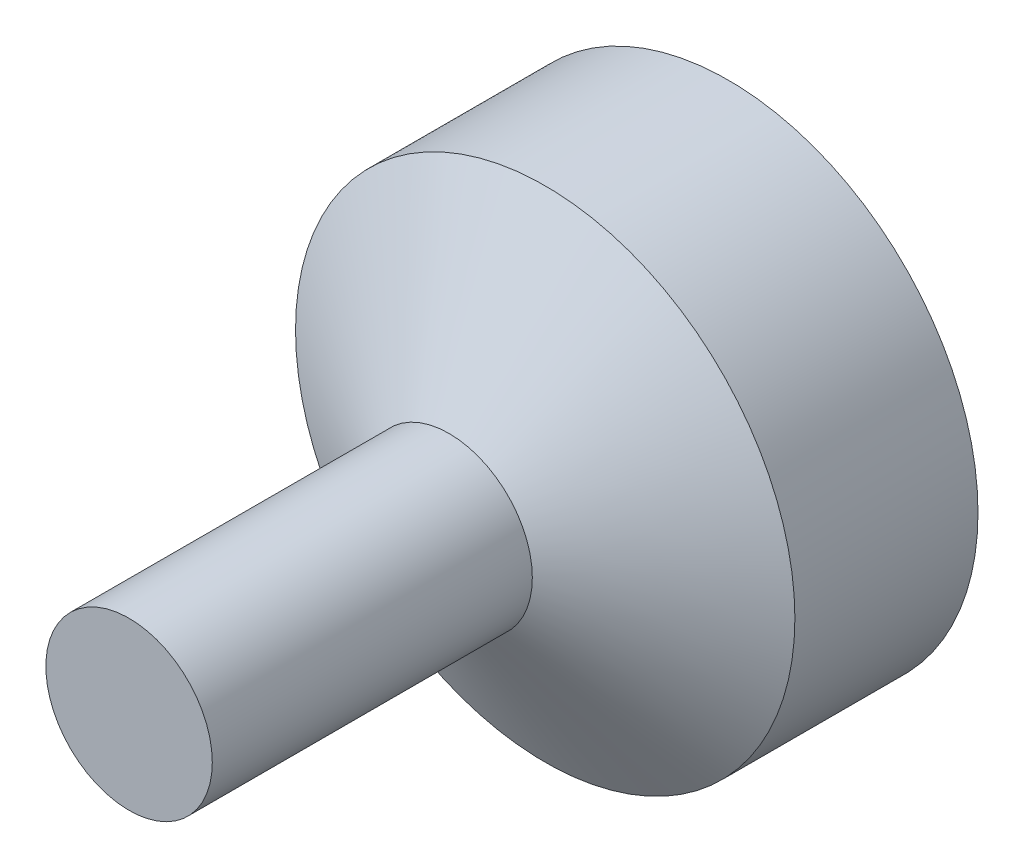
ISO-10303-21;
HEADER;
FILE_DESCRIPTION(('STEP AP214'),'2;1');
FILE_NAME('part.step','',(''),(''),'','','');
FILE_SCHEMA(('AUTOMOTIVE_DESIGN { 1 0 10303 214 1 1 1 1 }'));
ENDSEC;
DATA;
#1=APPLICATION_CONTEXT('core data for automotive mechanical design processes');
#2=APPLICATION_PROTOCOL_DEFINITION('international standard','automotive_design',2000,#1);
#3=PRODUCT_CONTEXT('',#1,'mechanical');
#4=PRODUCT('Part','Part','',(#3));
#5=PRODUCT_RELATED_PRODUCT_CATEGORY('part','',(#4));
#6=PRODUCT_DEFINITION_FORMATION('','',#4);
#7=PRODUCT_DEFINITION_CONTEXT('part definition',#1,'design');
#8=PRODUCT_DEFINITION('design','',#6,#7);
#9=PRODUCT_DEFINITION_SHAPE('','',#8);
#10=(LENGTH_UNIT() NAMED_UNIT(*) SI_UNIT(.MILLI.,.METRE.));
#11=(NAMED_UNIT(*) PLANE_ANGLE_UNIT() SI_UNIT($,.RADIAN.));
#12=(NAMED_UNIT(*) SI_UNIT($,.STERADIAN.) SOLID_ANGLE_UNIT());
#13=UNCERTAINTY_MEASURE_WITH_UNIT(LENGTH_MEASURE(1.E-05),#10,'distance_accuracy_value','');
#14=(GEOMETRIC_REPRESENTATION_CONTEXT(3) GLOBAL_UNCERTAINTY_ASSIGNED_CONTEXT((#13)) GLOBAL_UNIT_ASSIGNED_CONTEXT((#10,
#11,#12)) REPRESENTATION_CONTEXT('',''));
#15=CARTESIAN_POINT('',(0.,0.,0.));
#16=DIRECTION('',(0.,0.,1.));
#17=DIRECTION('',(1.,0.,0.));
#18=AXIS2_PLACEMENT_3D('',#15,#16,#17);
#19=CARTESIAN_POINT('',(0.,0.,110.));
#20=DIRECTION('',(0.,0.,1.));
#21=DIRECTION('',(1.,0.,0.));
#22=AXIS2_PLACEMENT_3D('',#19,#20,#21);
#23=CYLINDRICAL_SURFACE('',#22,100.);
#24=CARTESIAN_POINT('',(0.,0.,225.470053837926));
#25=DIRECTION('',(0.,0.,-1.));
#26=DIRECTION('',(-1.,0.,0.));
#27=AXIS2_PLACEMENT_3D('',#24,#25,#26);
#28=CIRCLE('',#27,100.);
#29=CARTESIAN_POINT('',(-100.,0.,225.470053837926));
#30=VERTEX_POINT('',#29);
#31=EDGE_CURVE('E10',#30,#30,#28,.F.);
#32=ORIENTED_EDGE('',*,*,#31,.T.);
#33=EDGE_LOOP('',(#32));
#34=FACE_BOUND('',#33,.T.);
#35=CARTESIAN_POINT('',(0.,0.,610.));
#36=DIRECTION('',(0.,0.,1.));
#37=DIRECTION('',(1.,0.,0.));
#38=AXIS2_PLACEMENT_3D('',#35,#36,#37);
#39=CIRCLE('',#38,100.);
#40=CARTESIAN_POINT('',(100.,0.,610.));
#41=VERTEX_POINT('',#40);
#42=EDGE_CURVE('E56',#41,#41,#39,.T.);
#43=ORIENTED_EDGE('',*,*,#42,.F.);
#44=EDGE_LOOP('',(#43));
#45=FACE_BOUND('',#44,.T.);
#46=ADVANCED_FACE('F47',(#34,#45),#23,.T.);
#47=CARTESIAN_POINT('',(0.,0.,610.));
#48=DIRECTION('',(0.,0.,1.));
#49=DIRECTION('',(1.,0.,0.));
#50=AXIS2_PLACEMENT_3D('',#47,#48,#49);
#51=PLANE('',#50);
#52=ORIENTED_EDGE('',*,*,#42,.T.);
#53=EDGE_LOOP('',(#52));
#54=FACE_BOUND('',#53,.T.);
#55=ADVANCED_FACE('F84',(#54),#51,.T.);
#56=CARTESIAN_POINT('',(0.,0.,-110.));
#57=DIRECTION('',(0.,0.,1.));
#58=DIRECTION('',(1.,0.,0.));
#59=AXIS2_PLACEMENT_3D('',#56,#57,#58);
#60=CYLINDRICAL_SURFACE('',#59,300.);
#61=CARTESIAN_POINT('',(0.,0.,-110.));
#62=DIRECTION('',(0.,0.,-1.));
#63=DIRECTION('',(-1.,0.,0.));
#64=AXIS2_PLACEMENT_3D('',#61,#62,#63);
#65=CIRCLE('',#64,300.);
#66=CARTESIAN_POINT('',(-300.,0.,-110.));
#67=VERTEX_POINT('',#66);
#68=EDGE_CURVE('E61',#67,#67,#65,.T.);
#69=ORIENTED_EDGE('',*,*,#68,.F.);
#70=EDGE_LOOP('',(#69));
#71=FACE_BOUND('',#70,.T.);
#72=CARTESIAN_POINT('',(0.,0.,110.));
#73=DIRECTION('',(0.,0.,-1.));
#74=DIRECTION('',(-1.,0.,0.));
#75=AXIS2_PLACEMENT_3D('',#72,#73,#74);
#76=CIRCLE('',#75,300.);
#77=CARTESIAN_POINT('',(-299.999999999999,0.,110.));
#78=VERTEX_POINT('',#77);
#79=EDGE_CURVE('E66',#78,#78,#76,.T.);
#80=ORIENTED_EDGE('',*,*,#79,.T.);
#81=EDGE_LOOP('',(#80));
#82=FACE_BOUND('',#81,.T.);
#83=ADVANCED_FACE('F73',(#71,#82),#60,.T.);
#84=CARTESIAN_POINT('',(0.,0.,-110.));
#85=DIRECTION('',(0.,0.,-1.));
#86=DIRECTION('',(-1.,0.,0.));
#87=AXIS2_PLACEMENT_3D('',#84,#85,#86);
#88=PLANE('',#87);
#89=ORIENTED_EDGE('',*,*,#68,.T.);
#90=EDGE_LOOP('',(#89));
#91=FACE_BOUND('',#90,.T.);
#92=ADVANCED_FACE('F77',(#91),#88,.T.);
#93=CARTESIAN_POINT('',(0.,0.,225.470053837926));
#94=DIRECTION('',(0.,0.,-1.));
#95=DIRECTION('',(-1.,0.,0.));
#96=AXIS2_PLACEMENT_3D('',#93,#94,#95);
#97=CONICAL_SURFACE('',#96,100.,1.04719755119659);
#98=CARTESIAN_POINT('',(-299.999999999999,0.,110.));
#99=CARTESIAN_POINT('',(-297.916666666665,0.,111.202813060812));
#100=CARTESIAN_POINT('',(-295.833333333332,0.,112.405626121623));
#101=CARTESIAN_POINT('',(-291.666666666665,0.,114.811252243247));
#102=CARTESIAN_POINT('',(-289.583333333332,0.,116.014065304059));
#103=CARTESIAN_POINT('',(-285.416666666666,0.,118.419691425682));
#104=CARTESIAN_POINT('',(-283.333333333332,0.,119.622504486494));
#105=CARTESIAN_POINT('',(-279.166666666666,0.,122.028130608117));
#106=CARTESIAN_POINT('',(-277.083333333332,0.,123.230943668929));
#107=CARTESIAN_POINT('',(-272.916666666666,0.,125.636569790552));
#108=CARTESIAN_POINT('',(-270.833333333332,0.,126.839382851364));
#109=CARTESIAN_POINT('',(-266.666666666666,0.,129.245008972988));
#110=CARTESIAN_POINT('',(-264.583333333332,0.,130.447822033799));
#111=CARTESIAN_POINT('',(-260.416666666666,0.,132.853448155423));
#112=CARTESIAN_POINT('',(-258.333333333332,0.,134.056261216235));
#113=CARTESIAN_POINT('',(-254.166666666666,0.,136.461887337858));
#114=CARTESIAN_POINT('',(-252.083333333332,0.,137.66470039867));
#115=CARTESIAN_POINT('',(-247.916666666666,0.,140.070326520293));
#116=CARTESIAN_POINT('',(-245.833333333332,0.,141.273139581105));
#117=CARTESIAN_POINT('',(-241.666666666666,0.,143.678765702728));
#118=CARTESIAN_POINT('',(-239.583333333333,0.,144.88157876354));
#119=CARTESIAN_POINT('',(-235.416666666666,0.,147.287204885164));
#120=CARTESIAN_POINT('',(-233.333333333333,0.,148.490017945975));
#121=CARTESIAN_POINT('',(-229.166666666666,0.,150.895644067599));
#122=CARTESIAN_POINT('',(-227.083333333333,0.,152.09845712841));
#123=CARTESIAN_POINT('',(-222.916666666666,0.,154.504083250034));
#124=CARTESIAN_POINT('',(-220.833333333333,0.,155.706896310846));
#125=CARTESIAN_POINT('',(-216.666666666666,0.,158.112522432469));
#126=CARTESIAN_POINT('',(-214.583333333333,0.,159.315335493281));
#127=CARTESIAN_POINT('',(-210.416666666666,0.,161.720961614904));
#128=CARTESIAN_POINT('',(-208.333333333333,0.,162.923774675716));
#129=CARTESIAN_POINT('',(-204.166666666666,0.,165.329400797339));
#130=CARTESIAN_POINT('',(-202.083333333333,0.,166.532213858151));
#131=CARTESIAN_POINT('',(-197.916666666666,0.,168.937839979775));
#132=CARTESIAN_POINT('',(-195.833333333333,0.,170.140653040586));
#133=CARTESIAN_POINT('',(-191.666666666666,0.,172.54627916221));
#134=CARTESIAN_POINT('',(-189.583333333333,0.,173.749092223022));
#135=CARTESIAN_POINT('',(-185.416666666666,0.,176.154718344645));
#136=CARTESIAN_POINT('',(-183.333333333333,0.,177.357531405457));
#137=CARTESIAN_POINT('',(-179.166666666666,0.,179.76315752708));
#138=CARTESIAN_POINT('',(-177.083333333333,0.,180.965970587892));
#139=CARTESIAN_POINT('',(-172.916666666666,0.,183.371596709515));
#140=CARTESIAN_POINT('',(-170.833333333333,0.,184.574409770327));
#141=CARTESIAN_POINT('',(-166.666666666666,0.,186.980035891951));
#142=CARTESIAN_POINT('',(-164.583333333333,0.,188.182848952762));
#143=CARTESIAN_POINT('',(-160.416666666666,0.,190.588475074386));
#144=CARTESIAN_POINT('',(-158.333333333333,0.,191.791288135197));
#145=CARTESIAN_POINT('',(-154.166666666666,0.,194.196914256821));
#146=CARTESIAN_POINT('',(-152.083333333333,0.,195.399727317633));
#147=CARTESIAN_POINT('',(-147.916666666666,0.,197.805353439256));
#148=CARTESIAN_POINT('',(-145.833333333333,0.,199.008166500068));
#149=CARTESIAN_POINT('',(-141.666666666666,0.,201.413792621691));
#150=CARTESIAN_POINT('',(-139.583333333333,0.,202.616605682503));
#151=CARTESIAN_POINT('',(-135.416666666666,0.,205.022231804126));
#152=CARTESIAN_POINT('',(-133.333333333333,0.,206.225044864938));
#153=CARTESIAN_POINT('',(-129.166666666666,0.,208.630670986562));
#154=CARTESIAN_POINT('',(-127.083333333333,0.,209.833484047373));
#155=CARTESIAN_POINT('',(-122.916666666667,0.,212.239110168997));
#156=CARTESIAN_POINT('',(-120.833333333333,0.,213.441923229809));
#157=CARTESIAN_POINT('',(-116.666666666667,0.,215.847549351432));
#158=CARTESIAN_POINT('',(-114.583333333333,0.,217.050362412244));
#159=CARTESIAN_POINT('',(-110.416666666667,0.,219.455988533867));
#160=CARTESIAN_POINT('',(-108.333333333333,0.,220.658801594679));
#161=CARTESIAN_POINT('',(-104.166666666667,0.,223.064427716302));
#162=CARTESIAN_POINT('',(-102.083333333333,0.,224.267240777114));
#163=CARTESIAN_POINT('',(-100.,0.,225.470053837926));
#164=B_SPLINE_CURVE_WITH_KNOTS('',3,(#98,#99,#100,#101,#102,#103,#104,#105,#106,#107,#108,#109,
#110,#111,#112,#113,#114,#115,#116,#117,#118,#119,#120,#121,#122,#123,#124,#125,#126,#127,#128,
#129,#130,#131,#132,#133,#134,#135,#136,#137,#138,#139,#140,#141,#142,#143,#144,#145,#146,#147,
#148,#149,#150,#151,#152,#153,#154,#155,#156,#157,#158,#159,#160,#161,#162,#163),.UNSPECIFIED.,
.F.,.F.,(4,2,2,2,2,2,2,2,2,2,2,2,2,2,2,2,2,2,2,2,2,2,2,2,2,2,2,2,2,2,2,2,4),(0.,
7.21687836487031,14.4337567297406,21.6506350946109,28.8675134594813,36.0843918243515,
43.3012701892218,50.5181485540921,57.7350269189624,64.9519052838327,72.168783648703,
79.3856620135733,86.6025403784436,93.8194187433139,101.036297108184,108.253175473055,
115.470053837925,122.686932202795,129.903810567665,137.120688932536,144.337567297406,
151.554445662276,158.771324027147,165.988202392017,173.205080756887,180.421959121758,
187.638837486628,194.855715851498,202.072594216368,209.289472581239,216.506350946109,
223.723229310979,230.94010767585),.UNSPECIFIED.);
#165=EDGE_CURVE('BSEAM50',#78,#30,#164,.T.);
#166=ORIENTED_EDGE('',*,*,#79,.F.);
#167=ORIENTED_EDGE('',*,*,#31,.F.);
#168=ORIENTED_EDGE('',*,*,#165,.T.);
#169=ORIENTED_EDGE('',*,*,#165,.F.);
#170=EDGE_LOOP('',(#166,#168,#167,#169));
#171=FACE_BOUND('',#170,.T.);
#172=ADVANCED_FACE('F50',(#171),#97,.T.);
#173=CLOSED_SHELL('',(#46,#55,#83,#92,#172));
#174=MANIFOLD_SOLID_BREP('B2',#173);
#175=ADVANCED_BREP_SHAPE_REPRESENTATION('',(#18,#174),#14);
#176=SHAPE_DEFINITION_REPRESENTATION(#9,#175);
ENDSEC;
END-ISO-10303-21;
